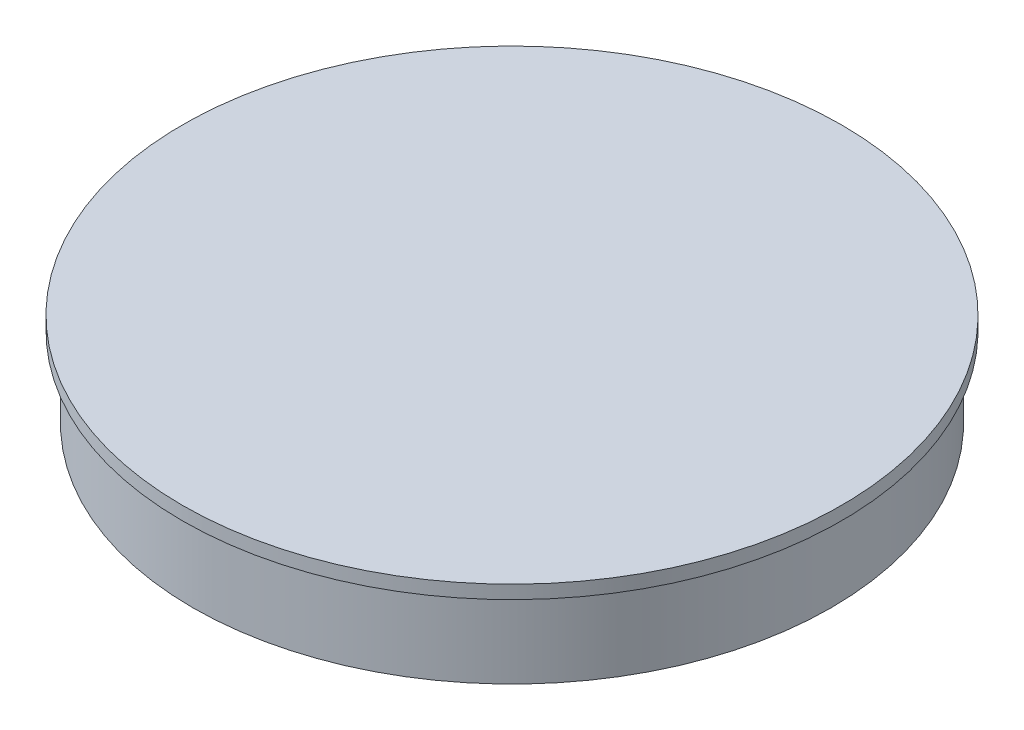
ISO-10303-21;
HEADER;
FILE_DESCRIPTION(('STEP AP214'),'2;1');
FILE_NAME('part.step','',(''),(''),'','','');
FILE_SCHEMA(('AUTOMOTIVE_DESIGN { 1 0 10303 214 1 1 1 1 }'));
ENDSEC;
DATA;
#1=APPLICATION_CONTEXT('core data for automotive mechanical design processes');
#2=APPLICATION_PROTOCOL_DEFINITION('international standard','automotive_design',2000,#1);
#3=PRODUCT_CONTEXT('',#1,'mechanical');
#4=PRODUCT('Part','Part','',(#3));
#5=PRODUCT_RELATED_PRODUCT_CATEGORY('part','',(#4));
#6=PRODUCT_DEFINITION_FORMATION('','',#4);
#7=PRODUCT_DEFINITION_CONTEXT('part definition',#1,'design');
#8=PRODUCT_DEFINITION('design','',#6,#7);
#9=PRODUCT_DEFINITION_SHAPE('','',#8);
#10=(LENGTH_UNIT() NAMED_UNIT(*) SI_UNIT(.MILLI.,.METRE.));
#11=(NAMED_UNIT(*) PLANE_ANGLE_UNIT() SI_UNIT($,.RADIAN.));
#12=(NAMED_UNIT(*) SI_UNIT($,.STERADIAN.) SOLID_ANGLE_UNIT());
#13=UNCERTAINTY_MEASURE_WITH_UNIT(LENGTH_MEASURE(1.E-05),#10,'distance_accuracy_value','');
#14=(GEOMETRIC_REPRESENTATION_CONTEXT(3) GLOBAL_UNCERTAINTY_ASSIGNED_CONTEXT((#13)) GLOBAL_UNIT_ASSIGNED_CONTEXT((#10,
#11,#12)) REPRESENTATION_CONTEXT('',''));
#15=CARTESIAN_POINT('',(0.,0.,0.));
#16=DIRECTION('',(0.,0.,1.));
#17=DIRECTION('',(1.,0.,0.));
#18=AXIS2_PLACEMENT_3D('',#15,#16,#17);
#19=CARTESIAN_POINT('',(0.,0.,0.));
#20=DIRECTION('',(0.,1.,0.));
#21=DIRECTION('',(0.,0.,1.));
#22=AXIS2_PLACEMENT_3D('',#19,#20,#21);
#23=PLANE('',#22);
#24=CARTESIAN_POINT('',(0.,0.,0.));
#25=DIRECTION('',(0.,1.,0.));
#26=DIRECTION('',(0.,0.,1.));
#27=AXIS2_PLACEMENT_3D('',#24,#25,#26);
#28=CIRCLE('',#27,35.75);
#29=CARTESIAN_POINT('',(0.,0.,35.75));
#30=VERTEX_POINT('',#29);
#31=EDGE_CURVE('E41',#30,#30,#28,.T.);
#32=ORIENTED_EDGE('',*,*,#31,.F.);
#33=EDGE_LOOP('',(#32));
#34=FACE_BOUND('',#33,.T.);
#35=CARTESIAN_POINT('',(0.,0.,0.));
#36=DIRECTION('',(0.,1.,0.));
#37=DIRECTION('',(0.,0.,1.));
#38=AXIS2_PLACEMENT_3D('',#35,#36,#37);
#39=CIRCLE('',#38,34.75);
#40=CARTESIAN_POINT('',(0.,0.,34.75));
#41=VERTEX_POINT('',#40);
#42=EDGE_CURVE('E50',#41,#41,#39,.T.);
#43=ORIENTED_EDGE('',*,*,#42,.T.);
#44=EDGE_LOOP('',(#43));
#45=FACE_BOUND('',#44,.T.);
#46=ADVANCED_FACE('F37',(#34,#45),#23,.F.);
#47=CARTESIAN_POINT('',(0.,9.,0.));
#48=DIRECTION('',(0.,-1.,0.));
#49=DIRECTION('',(0.,0.,-1.));
#50=AXIS2_PLACEMENT_3D('',#47,#48,#49);
#51=CYLINDRICAL_SURFACE('',#50,35.75);
#52=CARTESIAN_POINT('',(0.,9.,0.));
#53=DIRECTION('',(0.,1.,0.));
#54=DIRECTION('',(0.,0.,1.));
#55=AXIS2_PLACEMENT_3D('',#52,#53,#54);
#56=CIRCLE('',#55,35.75);
#57=CARTESIAN_POINT('',(0.,9.,35.75));
#58=VERTEX_POINT('',#57);
#59=EDGE_CURVE('E10',#58,#58,#56,.T.);
#60=ORIENTED_EDGE('',*,*,#59,.F.);
#61=EDGE_LOOP('',(#60));
#62=FACE_BOUND('',#61,.T.);
#63=ORIENTED_EDGE('',*,*,#31,.T.);
#64=EDGE_LOOP('',(#63));
#65=FACE_BOUND('',#64,.T.);
#66=ADVANCED_FACE('F39',(#62,#65),#51,.T.);
#67=CARTESIAN_POINT('',(0.,9.,0.));
#68=DIRECTION('',(0.,-1.,0.));
#69=DIRECTION('',(0.,0.,-1.));
#70=AXIS2_PLACEMENT_3D('',#67,#68,#69);
#71=CYLINDRICAL_SURFACE('',#70,34.75);
#72=CARTESIAN_POINT('',(0.,9.,0.));
#73=DIRECTION('',(0.,1.,0.));
#74=DIRECTION('',(0.,0.,1.));
#75=AXIS2_PLACEMENT_3D('',#72,#73,#74);
#76=CIRCLE('',#75,34.75);
#77=CARTESIAN_POINT('',(0.,9.,34.75));
#78=VERTEX_POINT('',#77);
#79=EDGE_CURVE('E55',#78,#78,#76,.T.);
#80=ORIENTED_EDGE('',*,*,#79,.T.);
#81=EDGE_LOOP('',(#80));
#82=FACE_BOUND('',#81,.T.);
#83=ORIENTED_EDGE('',*,*,#42,.F.);
#84=EDGE_LOOP('',(#83));
#85=FACE_BOUND('',#84,.T.);
#86=ADVANCED_FACE('F85',(#82,#85),#71,.F.);
#87=CARTESIAN_POINT('',(0.,9.,0.));
#88=DIRECTION('',(0.,1.,0.));
#89=DIRECTION('',(0.,0.,1.));
#90=AXIS2_PLACEMENT_3D('',#87,#88,#89);
#91=PLANE('',#90);
#92=ORIENTED_EDGE('',*,*,#79,.F.);
#93=EDGE_LOOP('',(#92));
#94=FACE_BOUND('',#93,.T.);
#95=ADVANCED_FACE('F73',(#94),#91,.F.);
#96=CARTESIAN_POINT('',(0.,10.5,0.));
#97=DIRECTION('',(0.,-1.,0.));
#98=DIRECTION('',(0.,0.,-1.));
#99=AXIS2_PLACEMENT_3D('',#96,#97,#98);
#100=CYLINDRICAL_SURFACE('',#99,36.9);
#101=CARTESIAN_POINT('',(0.,10.5,0.));
#102=DIRECTION('',(0.,1.,0.));
#103=DIRECTION('',(0.,0.,1.));
#104=AXIS2_PLACEMENT_3D('',#101,#102,#103);
#105=CIRCLE('',#104,36.9);
#106=CARTESIAN_POINT('',(0.,10.5,36.9));
#107=VERTEX_POINT('',#106);
#108=EDGE_CURVE('E59',#107,#107,#105,.T.);
#109=ORIENTED_EDGE('',*,*,#108,.F.);
#110=EDGE_LOOP('',(#109));
#111=FACE_BOUND('',#110,.T.);
#112=CARTESIAN_POINT('',(0.,9.,0.));
#113=DIRECTION('',(0.,1.,0.));
#114=DIRECTION('',(0.,0.,1.));
#115=AXIS2_PLACEMENT_3D('',#112,#113,#114);
#116=CIRCLE('',#115,36.9);
#117=CARTESIAN_POINT('',(0.,9.,36.9));
#118=VERTEX_POINT('',#117);
#119=EDGE_CURVE('E60',#118,#118,#116,.T.);
#120=ORIENTED_EDGE('',*,*,#119,.T.);
#121=EDGE_LOOP('',(#120));
#122=FACE_BOUND('',#121,.T.);
#123=ADVANCED_FACE('F70',(#111,#122),#100,.T.);
#124=CARTESIAN_POINT('',(0.,10.5,0.));
#125=DIRECTION('',(0.,1.,0.));
#126=DIRECTION('',(0.,0.,1.));
#127=AXIS2_PLACEMENT_3D('',#124,#125,#126);
#128=PLANE('',#127);
#129=ORIENTED_EDGE('',*,*,#108,.T.);
#130=EDGE_LOOP('',(#129));
#131=FACE_BOUND('',#130,.T.);
#132=ADVANCED_FACE('F68',(#131),#128,.T.);
#133=ORIENTED_EDGE('',*,*,#59,.T.);
#134=EDGE_LOOP('',(#133));
#135=FACE_BOUND('',#134,.T.);
#136=ORIENTED_EDGE('',*,*,#119,.F.);
#137=EDGE_LOOP('',(#136));
#138=FACE_BOUND('',#137,.T.);
#139=ADVANCED_FACE('F77',(#135,#138),#91,.F.);
#140=CLOSED_SHELL('',(#46,#66,#86,#95,#123,#132,#139));
#141=MANIFOLD_SOLID_BREP('B2',#140);
#142=ADVANCED_BREP_SHAPE_REPRESENTATION('',(#18,#141),#14);
#143=SHAPE_DEFINITION_REPRESENTATION(#9,#142);
ENDSEC;
END-ISO-10303-21;
